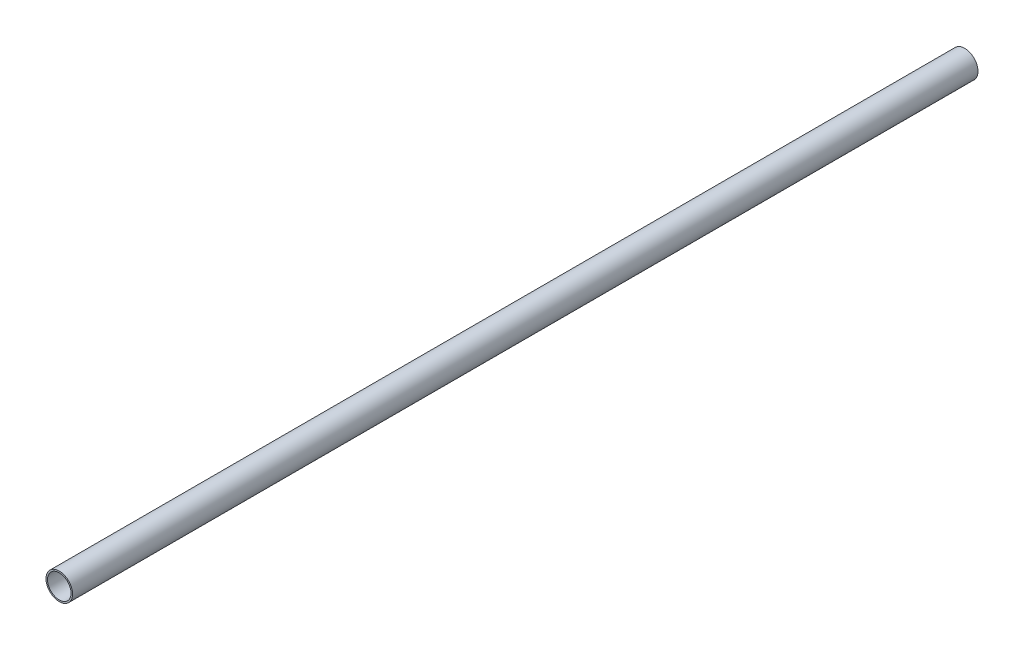
ISO-10303-21;
HEADER;
FILE_DESCRIPTION(('STEP AP214'),'2;1');
FILE_NAME('part.step','',(''),(''),'','','');
FILE_SCHEMA(('AUTOMOTIVE_DESIGN { 1 0 10303 214 1 1 1 1 }'));
ENDSEC;
DATA;
#1=APPLICATION_CONTEXT('core data for automotive mechanical design processes');
#2=APPLICATION_PROTOCOL_DEFINITION('international standard','automotive_design',2000,#1);
#3=PRODUCT_CONTEXT('',#1,'mechanical');
#4=PRODUCT('Part','Part','',(#3));
#5=PRODUCT_RELATED_PRODUCT_CATEGORY('part','',(#4));
#6=PRODUCT_DEFINITION_FORMATION('','',#4);
#7=PRODUCT_DEFINITION_CONTEXT('part definition',#1,'design');
#8=PRODUCT_DEFINITION('design','',#6,#7);
#9=PRODUCT_DEFINITION_SHAPE('','',#8);
#10=(LENGTH_UNIT() NAMED_UNIT(*) SI_UNIT(.MILLI.,.METRE.));
#11=(NAMED_UNIT(*) PLANE_ANGLE_UNIT() SI_UNIT($,.RADIAN.));
#12=(NAMED_UNIT(*) SI_UNIT($,.STERADIAN.) SOLID_ANGLE_UNIT());
#13=UNCERTAINTY_MEASURE_WITH_UNIT(LENGTH_MEASURE(1.E-05),#10,'distance_accuracy_value','');
#14=(GEOMETRIC_REPRESENTATION_CONTEXT(3) GLOBAL_UNCERTAINTY_ASSIGNED_CONTEXT((#13)) GLOBAL_UNIT_ASSIGNED_CONTEXT((#10,
#11,#12)) REPRESENTATION_CONTEXT('',''));
#15=CARTESIAN_POINT('',(0.,0.,0.));
#16=DIRECTION('',(0.,0.,1.));
#17=DIRECTION('',(1.,0.,0.));
#18=AXIS2_PLACEMENT_3D('',#15,#16,#17);
#19=CARTESIAN_POINT('',(0.,0.,0.));
#20=DIRECTION('',(0.,0.,-1.));
#21=DIRECTION('',(0.,-1.,0.));
#22=AXIS2_PLACEMENT_3D('',#19,#20,#21);
#23=CYLINDRICAL_SURFACE('',#22,16.891);
#24=CARTESIAN_POINT('',(0.,0.,-1298.702));
#25=DIRECTION('',(0.,0.,1.));
#26=DIRECTION('',(1.,0.,0.));
#27=AXIS2_PLACEMENT_3D('',#24,#25,#26);
#28=CIRCLE('',#27,16.891);
#29=CARTESIAN_POINT('',(16.891,0.,-1298.702));
#30=VERTEX_POINT('',#29);
#31=EDGE_CURVE('E25',#30,#30,#28,.T.);
#32=ORIENTED_EDGE('',*,*,#31,.F.);
#33=EDGE_LOOP('',(#32));
#34=FACE_BOUND('',#33,.T.);
#35=CARTESIAN_POINT('',(0.,0.,0.));
#36=DIRECTION('',(0.,0.,-1.));
#37=DIRECTION('',(0.,-1.,0.));
#38=AXIS2_PLACEMENT_3D('',#35,#36,#37);
#39=CIRCLE('',#38,16.891);
#40=CARTESIAN_POINT('',(0.,-16.891,0.));
#41=VERTEX_POINT('',#40);
#42=EDGE_CURVE('E29',#41,#41,#39,.T.);
#43=ORIENTED_EDGE('',*,*,#42,.F.);
#44=EDGE_LOOP('',(#43));
#45=FACE_BOUND('',#44,.T.);
#46=ADVANCED_FACE('F14',(#34,#45),#23,.F.);
#47=CARTESIAN_POINT('',(0.,0.,0.));
#48=DIRECTION('',(0.,0.,-1.));
#49=DIRECTION('',(0.,-1.,0.));
#50=AXIS2_PLACEMENT_3D('',#47,#48,#49);
#51=CYLINDRICAL_SURFACE('',#50,19.05);
#52=CARTESIAN_POINT('',(0.,0.,-1298.702));
#53=DIRECTION('',(0.,0.,-1.));
#54=DIRECTION('',(0.,-1.,0.));
#55=AXIS2_PLACEMENT_3D('',#52,#53,#54);
#56=CIRCLE('',#55,19.05);
#57=CARTESIAN_POINT('',(0.,-19.05,-1298.702));
#58=VERTEX_POINT('',#57);
#59=EDGE_CURVE('E21',#58,#58,#56,.T.);
#60=ORIENTED_EDGE('',*,*,#59,.F.);
#61=EDGE_LOOP('',(#60));
#62=FACE_BOUND('',#61,.T.);
#63=CARTESIAN_POINT('',(0.,0.,0.));
#64=DIRECTION('',(0.,0.,-1.));
#65=DIRECTION('',(0.,-1.,0.));
#66=AXIS2_PLACEMENT_3D('',#63,#64,#65);
#67=CIRCLE('',#66,19.05);
#68=CARTESIAN_POINT('',(0.,-19.05,0.));
#69=VERTEX_POINT('',#68);
#70=EDGE_CURVE('E9',#69,#69,#67,.T.);
#71=ORIENTED_EDGE('',*,*,#70,.T.);
#72=EDGE_LOOP('',(#71));
#73=FACE_BOUND('',#72,.T.);
#74=ADVANCED_FACE('F16',(#62,#73),#51,.T.);
#75=CARTESIAN_POINT('',(0.,0.,-1298.702));
#76=DIRECTION('',(0.,0.,1.));
#77=DIRECTION('',(1.,0.,0.));
#78=AXIS2_PLACEMENT_3D('',#75,#76,#77);
#79=PLANE('',#78);
#80=ORIENTED_EDGE('',*,*,#59,.T.);
#81=EDGE_LOOP('',(#80));
#82=FACE_BOUND('',#81,.T.);
#83=ORIENTED_EDGE('',*,*,#31,.T.);
#84=EDGE_LOOP('',(#83));
#85=FACE_BOUND('',#84,.T.);
#86=ADVANCED_FACE('F43',(#82,#85),#79,.F.);
#87=CARTESIAN_POINT('',(0.,0.,0.));
#88=DIRECTION('',(0.,0.,1.));
#89=DIRECTION('',(1.,0.,0.));
#90=AXIS2_PLACEMENT_3D('',#87,#88,#89);
#91=PLANE('',#90);
#92=ORIENTED_EDGE('',*,*,#70,.F.);
#93=EDGE_LOOP('',(#92));
#94=FACE_BOUND('',#93,.T.);
#95=ORIENTED_EDGE('',*,*,#42,.T.);
#96=EDGE_LOOP('',(#95));
#97=FACE_BOUND('',#96,.T.);
#98=ADVANCED_FACE('F35',(#94,#97),#91,.T.);
#99=CLOSED_SHELL('',(#46,#74,#86,#98));
#100=MANIFOLD_SOLID_BREP('B1',#99);
#101=ADVANCED_BREP_SHAPE_REPRESENTATION('',(#18,#100),#14);
#102=SHAPE_DEFINITION_REPRESENTATION(#9,#101);
ENDSEC;
END-ISO-10303-21;
